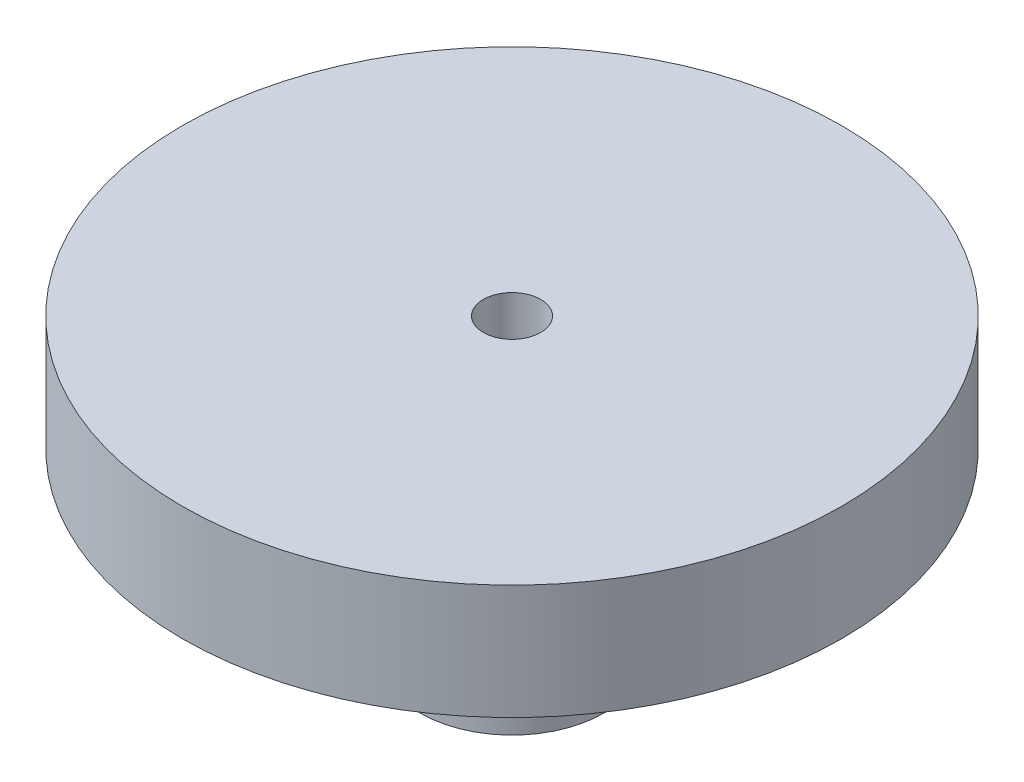
ISO-10303-21;
HEADER;
FILE_DESCRIPTION(('STEP AP214'),'2;1');
FILE_NAME('part.step','',(''),(''),'','','');
FILE_SCHEMA(('AUTOMOTIVE_DESIGN { 1 0 10303 214 1 1 1 1 }'));
ENDSEC;
DATA;
#1=APPLICATION_CONTEXT('core data for automotive mechanical design processes');
#2=APPLICATION_PROTOCOL_DEFINITION('international standard','automotive_design',2000,#1);
#3=PRODUCT_CONTEXT('',#1,'mechanical');
#4=PRODUCT('Part','Part','',(#3));
#5=PRODUCT_RELATED_PRODUCT_CATEGORY('part','',(#4));
#6=PRODUCT_DEFINITION_FORMATION('','',#4);
#7=PRODUCT_DEFINITION_CONTEXT('part definition',#1,'design');
#8=PRODUCT_DEFINITION('design','',#6,#7);
#9=PRODUCT_DEFINITION_SHAPE('','',#8);
#10=(LENGTH_UNIT() NAMED_UNIT(*) SI_UNIT(.MILLI.,.METRE.));
#11=(NAMED_UNIT(*) PLANE_ANGLE_UNIT() SI_UNIT($,.RADIAN.));
#12=(NAMED_UNIT(*) SI_UNIT($,.STERADIAN.) SOLID_ANGLE_UNIT());
#13=UNCERTAINTY_MEASURE_WITH_UNIT(LENGTH_MEASURE(1.E-05),#10,'distance_accuracy_value','');
#14=(GEOMETRIC_REPRESENTATION_CONTEXT(3) GLOBAL_UNCERTAINTY_ASSIGNED_CONTEXT((#13)) GLOBAL_UNIT_ASSIGNED_CONTEXT((#10,
#11,#12)) REPRESENTATION_CONTEXT('',''));
#15=CARTESIAN_POINT('',(0.,0.,0.));
#16=DIRECTION('',(0.,0.,1.));
#17=DIRECTION('',(1.,0.,0.));
#18=AXIS2_PLACEMENT_3D('',#15,#16,#17);
#19=CARTESIAN_POINT('',(0.,0.,0.));
#20=DIRECTION('',(0.,1.,0.));
#21=DIRECTION('',(0.,0.,1.));
#22=AXIS2_PLACEMENT_3D('',#19,#20,#21);
#23=PLANE('',#22);
#24=CARTESIAN_POINT('',(0.,0.,0.));
#25=DIRECTION('',(0.,1.,0.));
#26=DIRECTION('',(0.,0.,1.));
#27=AXIS2_PLACEMENT_3D('',#24,#25,#26);
#28=CIRCLE('',#27,8.);
#29=CARTESIAN_POINT('',(0.,0.,8.));
#30=VERTEX_POINT('',#29);
#31=EDGE_CURVE('E45',#30,#30,#28,.T.);
#32=ORIENTED_EDGE('',*,*,#31,.F.);
#33=EDGE_LOOP('',(#32));
#34=FACE_BOUND('',#33,.T.);
#35=CARTESIAN_POINT('',(0.,0.,0.));
#36=DIRECTION('',(0.,1.,0.));
#37=DIRECTION('',(0.,0.,1.));
#38=AXIS2_PLACEMENT_3D('',#35,#36,#37);
#39=CIRCLE('',#38,2.5);
#40=CARTESIAN_POINT('',(0.,0.,2.5));
#41=VERTEX_POINT('',#40);
#42=EDGE_CURVE('E54',#41,#41,#39,.T.);
#43=ORIENTED_EDGE('',*,*,#42,.T.);
#44=EDGE_LOOP('',(#43));
#45=FACE_BOUND('',#44,.T.);
#46=ADVANCED_FACE('F41',(#34,#45),#23,.F.);
#47=CARTESIAN_POINT('',(0.,16.,0.));
#48=DIRECTION('',(0.,-1.,0.));
#49=DIRECTION('',(0.,0.,-1.));
#50=AXIS2_PLACEMENT_3D('',#47,#48,#49);
#51=CYLINDRICAL_SURFACE('',#50,8.);
#52=CARTESIAN_POINT('',(0.,16.,0.));
#53=DIRECTION('',(0.,1.,0.));
#54=DIRECTION('',(0.,0.,1.));
#55=AXIS2_PLACEMENT_3D('',#52,#53,#54);
#56=CIRCLE('',#55,8.);
#57=CARTESIAN_POINT('',(0.,16.,8.));
#58=VERTEX_POINT('',#57);
#59=EDGE_CURVE('E10',#58,#58,#56,.T.);
#60=ORIENTED_EDGE('',*,*,#59,.F.);
#61=EDGE_LOOP('',(#60));
#62=FACE_BOUND('',#61,.T.);
#63=ORIENTED_EDGE('',*,*,#31,.T.);
#64=EDGE_LOOP('',(#63));
#65=FACE_BOUND('',#64,.T.);
#66=ADVANCED_FACE('F43',(#62,#65),#51,.T.);
#67=CARTESIAN_POINT('',(0.,16.,0.));
#68=DIRECTION('',(0.,-1.,0.));
#69=DIRECTION('',(0.,0.,-1.));
#70=AXIS2_PLACEMENT_3D('',#67,#68,#69);
#71=CYLINDRICAL_SURFACE('',#70,2.5);
#72=ORIENTED_EDGE('',*,*,#42,.F.);
#73=EDGE_LOOP('',(#72));
#74=FACE_BOUND('',#73,.T.);
#75=CARTESIAN_POINT('',(0.,26.,0.));
#76=DIRECTION('',(0.,1.,0.));
#77=DIRECTION('',(0.,0.,1.));
#78=AXIS2_PLACEMENT_3D('',#75,#76,#77);
#79=CIRCLE('',#78,2.5);
#80=CARTESIAN_POINT('',(0.,26.,2.5));
#81=VERTEX_POINT('',#80);
#82=EDGE_CURVE('E64',#81,#81,#79,.T.);
#83=ORIENTED_EDGE('',*,*,#82,.T.);
#84=EDGE_LOOP('',(#83));
#85=FACE_BOUND('',#84,.T.);
#86=ADVANCED_FACE('F72',(#74,#85),#71,.F.);
#87=CARTESIAN_POINT('',(0.,26.,0.));
#88=DIRECTION('',(0.,1.,0.));
#89=DIRECTION('',(0.,0.,1.));
#90=AXIS2_PLACEMENT_3D('',#87,#88,#89);
#91=PLANE('',#90);
#92=CARTESIAN_POINT('',(0.,26.,0.));
#93=DIRECTION('',(0.,1.,0.));
#94=DIRECTION('',(0.,0.,1.));
#95=AXIS2_PLACEMENT_3D('',#92,#93,#94);
#96=CIRCLE('',#95,28.75);
#97=CARTESIAN_POINT('',(0.,26.,28.75));
#98=VERTEX_POINT('',#97);
#99=EDGE_CURVE('E59',#98,#98,#96,.T.);
#100=ORIENTED_EDGE('',*,*,#99,.T.);
#101=EDGE_LOOP('',(#100));
#102=FACE_BOUND('',#101,.T.);
#103=ORIENTED_EDGE('',*,*,#82,.F.);
#104=EDGE_LOOP('',(#103));
#105=FACE_BOUND('',#104,.T.);
#106=ADVANCED_FACE('F74',(#102,#105),#91,.T.);
#107=CARTESIAN_POINT('',(0.,16.,0.));
#108=DIRECTION('',(0.,1.,0.));
#109=DIRECTION('',(0.,0.,1.));
#110=AXIS2_PLACEMENT_3D('',#107,#108,#109);
#111=PLANE('',#110);
#112=ORIENTED_EDGE('',*,*,#59,.T.);
#113=EDGE_LOOP('',(#112));
#114=FACE_BOUND('',#113,.T.);
#115=CARTESIAN_POINT('',(0.,16.,0.));
#116=DIRECTION('',(0.,1.,0.));
#117=DIRECTION('',(0.,0.,1.));
#118=AXIS2_PLACEMENT_3D('',#115,#116,#117);
#119=CIRCLE('',#118,28.75);
#120=CARTESIAN_POINT('',(0.,16.,28.75));
#121=VERTEX_POINT('',#120);
#122=EDGE_CURVE('E60',#121,#121,#119,.T.);
#123=ORIENTED_EDGE('',*,*,#122,.F.);
#124=EDGE_LOOP('',(#123));
#125=FACE_BOUND('',#124,.T.);
#126=ADVANCED_FACE('F76',(#114,#125),#111,.F.);
#127=CARTESIAN_POINT('',(0.,26.,0.));
#128=DIRECTION('',(0.,-1.,0.));
#129=DIRECTION('',(0.,0.,-1.));
#130=AXIS2_PLACEMENT_3D('',#127,#128,#129);
#131=CYLINDRICAL_SURFACE('',#130,28.75);
#132=ORIENTED_EDGE('',*,*,#99,.F.);
#133=EDGE_LOOP('',(#132));
#134=FACE_BOUND('',#133,.T.);
#135=ORIENTED_EDGE('',*,*,#122,.T.);
#136=EDGE_LOOP('',(#135));
#137=FACE_BOUND('',#136,.T.);
#138=ADVANCED_FACE('F83',(#134,#137),#131,.T.);
#139=CLOSED_SHELL('',(#46,#66,#86,#106,#126,#138));
#140=MANIFOLD_SOLID_BREP('B2',#139);
#141=ADVANCED_BREP_SHAPE_REPRESENTATION('',(#18,#140),#14);
#142=SHAPE_DEFINITION_REPRESENTATION(#9,#141);
ENDSEC;
END-ISO-10303-21;
